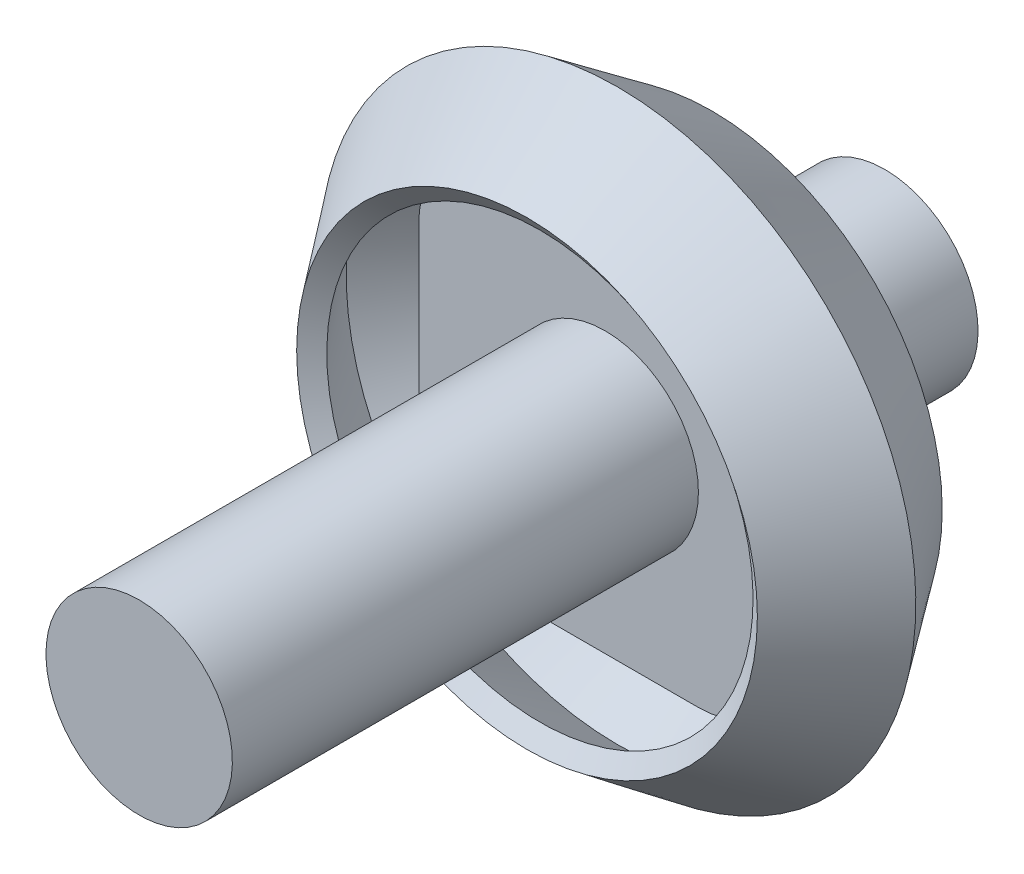
ISO-10303-21;
HEADER;
FILE_DESCRIPTION(('STEP AP214'),'2;1');
FILE_NAME('part.step','',(''),(''),'','','');
FILE_SCHEMA(('AUTOMOTIVE_DESIGN { 1 0 10303 214 1 1 1 1 }'));
ENDSEC;
DATA;
#1=APPLICATION_CONTEXT('core data for automotive mechanical design processes');
#2=APPLICATION_PROTOCOL_DEFINITION('international standard','automotive_design',2000,#1);
#3=PRODUCT_CONTEXT('',#1,'mechanical');
#4=PRODUCT('Part','Part','',(#3));
#5=PRODUCT_RELATED_PRODUCT_CATEGORY('part','',(#4));
#6=PRODUCT_DEFINITION_FORMATION('','',#4);
#7=PRODUCT_DEFINITION_CONTEXT('part definition',#1,'design');
#8=PRODUCT_DEFINITION('design','',#6,#7);
#9=PRODUCT_DEFINITION_SHAPE('','',#8);
#10=(LENGTH_UNIT() NAMED_UNIT(*) SI_UNIT(.MILLI.,.METRE.));
#11=(NAMED_UNIT(*) PLANE_ANGLE_UNIT() SI_UNIT($,.RADIAN.));
#12=(NAMED_UNIT(*) SI_UNIT($,.STERADIAN.) SOLID_ANGLE_UNIT());
#13=UNCERTAINTY_MEASURE_WITH_UNIT(LENGTH_MEASURE(1.E-05),#10,'distance_accuracy_value','');
#14=(GEOMETRIC_REPRESENTATION_CONTEXT(3) GLOBAL_UNCERTAINTY_ASSIGNED_CONTEXT((#13)) GLOBAL_UNIT_ASSIGNED_CONTEXT((#10,
#11,#12)) REPRESENTATION_CONTEXT('',''));
#15=CARTESIAN_POINT('',(0.,0.,0.));
#16=DIRECTION('',(0.,0.,1.));
#17=DIRECTION('',(1.,0.,0.));
#18=AXIS2_PLACEMENT_3D('',#15,#16,#17);
#19=CARTESIAN_POINT('',(0.,1.5875,0.));
#20=DIRECTION('',(0.,0.,-1.));
#21=DIRECTION('',(0.,-1.,0.));
#22=AXIS2_PLACEMENT_3D('',#19,#20,#21);
#23=PLANE('',#22);
#24=CARTESIAN_POINT('',(0.,0.,0.));
#25=DIRECTION('',(0.,0.,-1.));
#26=DIRECTION('',(0.,1.,0.));
#27=AXIS2_PLACEMENT_3D('',#24,#25,#26);
#28=CIRCLE('',#27,3.175);
#29=CARTESIAN_POINT('',(0.,3.175,0.));
#30=VERTEX_POINT('',#29);
#31=EDGE_CURVE('P0_E19',#30,#30,#28,.T.);
#32=ORIENTED_EDGE('',*,*,#31,.T.);
#33=EDGE_LOOP('',(#32));
#34=FACE_BOUND('',#33,.T.);
#35=ADVANCED_FACE('P0_F16',(#34),#23,.T.);
#36=CARTESIAN_POINT('',(0.,0.,12.7));
#37=DIRECTION('',(0.,0.,-1.));
#38=DIRECTION('',(0.,1.,0.));
#39=AXIS2_PLACEMENT_3D('',#36,#37,#38);
#40=CYLINDRICAL_SURFACE('',#39,3.175);
#41=CARTESIAN_POINT('',(0.,0.,25.4));
#42=DIRECTION('',(0.,0.,-1.));
#43=DIRECTION('',(0.,1.,0.));
#44=AXIS2_PLACEMENT_3D('',#41,#42,#43);
#45=CIRCLE('',#44,3.175);
#46=CARTESIAN_POINT('',(0.,3.175,25.4));
#47=VERTEX_POINT('',#46);
#48=EDGE_CURVE('P0_E11',#47,#47,#45,.T.);
#49=ORIENTED_EDGE('',*,*,#48,.T.);
#50=EDGE_LOOP('',(#49));
#51=FACE_BOUND('',#50,.T.);
#52=CARTESIAN_POINT('',(0.,0.,9.525));
#53=DIRECTION('',(0.,0.,1.));
#54=DIRECTION('',(0.,1.,0.));
#55=AXIS2_PLACEMENT_3D('',#52,#53,#54);
#56=CIRCLE('',#55,3.175);
#57=CARTESIAN_POINT('',(0.,-3.175,9.525));
#58=VERTEX_POINT('',#57);
#59=EDGE_CURVE('P0_E168',#58,#58,#56,.T.);
#60=ORIENTED_EDGE('',*,*,#59,.T.);
#61=EDGE_LOOP('',(#60));
#62=FACE_BOUND('',#61,.T.);
#63=ADVANCED_FACE('P0_F296',(#51,#62),#40,.T.);
#64=CARTESIAN_POINT('',(0.,1.5875,25.4));
#65=DIRECTION('',(0.,0.,1.));
#66=DIRECTION('',(1.,0.,0.));
#67=AXIS2_PLACEMENT_3D('',#64,#65,#66);
#68=PLANE('',#67);
#69=ORIENTED_EDGE('',*,*,#48,.F.);
#70=EDGE_LOOP('',(#69));
#71=FACE_BOUND('',#70,.T.);
#72=ADVANCED_FACE('P0_F301',(#71),#68,.T.);
#73=CARTESIAN_POINT('',(0.,0.,12.7));
#74=DIRECTION('',(0.,0.,-1.));
#75=DIRECTION('',(0.,1.,0.));
#76=AXIS2_PLACEMENT_3D('',#73,#74,#75);
#77=CYLINDRICAL_SURFACE('',#76,3.175);
#78=CARTESIAN_POINT('',(0.,0.,6.35));
#79=DIRECTION('',(0.,0.,-1.));
#80=DIRECTION('',(0.,1.,0.));
#81=AXIS2_PLACEMENT_3D('',#78,#79,#80);
#82=CIRCLE('',#81,3.175);
#83=CARTESIAN_POINT('',(0.,-3.175,6.35));
#84=VERTEX_POINT('',#83);
#85=EDGE_CURVE('P0_E156',#84,#84,#82,.T.);
#86=ORIENTED_EDGE('',*,*,#85,.T.);
#87=EDGE_LOOP('',(#86));
#88=FACE_BOUND('',#87,.T.);
#89=ORIENTED_EDGE('',*,*,#31,.F.);
#90=EDGE_LOOP('',(#89));
#91=FACE_BOUND('',#90,.T.);
#92=ADVANCED_FACE('P0_F466',(#88,#91),#77,.T.);
#93=CARTESIAN_POINT('',(3.175,6.35,6.35));
#94=DIRECTION('',(0.,1.,0.));
#95=DIRECTION('',(1.,0.,0.));
#96=AXIS2_PLACEMENT_3D('',#93,#94,#95);
#97=PLANE('',#96);
#98=DIRECTION('',(-1.,0.,0.));
#99=VECTOR('',#98,1.);
#100=CARTESIAN_POINT('',(3.175,6.35,6.35));
#101=LINE('',#100,#99);
#102=CARTESIAN_POINT('',(3.175,6.35,6.35));
#103=VERTEX_POINT('',#102);
#104=CARTESIAN_POINT('',(-3.175,6.35,6.35));
#105=VERTEX_POINT('',#104);
#106=EDGE_CURVE('P0_E164',#103,#105,#101,.T.);
#107=ORIENTED_EDGE('',*,*,#106,.T.);
#108=DIRECTION('',(0.,0.,1.));
#109=VECTOR('',#108,1.);
#110=CARTESIAN_POINT('',(-3.175,6.35,6.35));
#111=LINE('',#110,#109);
#112=CARTESIAN_POINT('',(-3.175,6.35,9.525));
#113=VERTEX_POINT('',#112);
#114=EDGE_CURVE('P0_E180',#105,#113,#111,.T.);
#115=ORIENTED_EDGE('',*,*,#114,.T.);
#116=DIRECTION('',(-1.,0.,0.));
#117=VECTOR('',#116,1.);
#118=CARTESIAN_POINT('',(3.175,6.35,9.525));
#119=LINE('',#118,#117);
#120=CARTESIAN_POINT('',(3.175,6.35,9.525));
#121=VERTEX_POINT('',#120);
#122=EDGE_CURVE('P0_E226',#121,#113,#119,.T.);
#123=ORIENTED_EDGE('',*,*,#122,.F.);
#124=DIRECTION('',(0.,0.,1.));
#125=VECTOR('',#124,1.);
#126=CARTESIAN_POINT('',(3.175,6.35,6.35));
#127=LINE('',#126,#125);
#128=EDGE_CURVE('P0_E159',#103,#121,#127,.T.);
#129=ORIENTED_EDGE('',*,*,#128,.F.);
#130=EDGE_LOOP('',(#107,#115,#123,#129));
#131=FACE_BOUND('',#130,.T.);
#132=ADVANCED_FACE('P0_F280',(#131),#97,.T.);
#133=CARTESIAN_POINT('',(-3.175,3.175,6.35));
#134=DIRECTION('',(0.,0.,1.));
#135=DIRECTION('',(0.,1.,0.));
#136=AXIS2_PLACEMENT_3D('',#133,#134,#135);
#137=CYLINDRICAL_SURFACE('',#136,3.175);
#138=CARTESIAN_POINT('',(-3.175,3.175,6.35));
#139=DIRECTION('',(0.,0.,1.));
#140=DIRECTION('',(0.,1.,0.));
#141=AXIS2_PLACEMENT_3D('',#138,#139,#140);
#142=CIRCLE('',#141,3.175);
#143=CARTESIAN_POINT('',(-6.35,3.175,6.35));
#144=VERTEX_POINT('',#143);
#145=EDGE_CURVE('P0_E160',#105,#144,#142,.T.);
#146=ORIENTED_EDGE('',*,*,#145,.T.);
#147=DIRECTION('',(0.,0.,1.));
#148=VECTOR('',#147,1.);
#149=CARTESIAN_POINT('',(-6.35,3.175,6.35));
#150=LINE('',#149,#148);
#151=CARTESIAN_POINT('',(-6.35,3.175,9.525));
#152=VERTEX_POINT('',#151);
#153=EDGE_CURVE('P0_E150',#144,#152,#150,.T.);
#154=ORIENTED_EDGE('',*,*,#153,.T.);
#155=CARTESIAN_POINT('',(-3.175,3.175,9.525));
#156=DIRECTION('',(0.,0.,1.));
#157=DIRECTION('',(0.,1.,0.));
#158=AXIS2_PLACEMENT_3D('',#155,#156,#157);
#159=CIRCLE('',#158,3.175);
#160=EDGE_CURVE('P0_E217',#113,#152,#159,.T.);
#161=ORIENTED_EDGE('',*,*,#160,.F.);
#162=ORIENTED_EDGE('',*,*,#114,.F.);
#163=EDGE_LOOP('',(#146,#154,#161,#162));
#164=FACE_BOUND('',#163,.T.);
#165=ADVANCED_FACE('P0_F206',(#164),#137,.T.);
#166=CARTESIAN_POINT('',(-6.35,3.175,6.35));
#167=DIRECTION('',(-1.,0.,0.));
#168=DIRECTION('',(0.,0.,1.));
#169=AXIS2_PLACEMENT_3D('',#166,#167,#168);
#170=PLANE('',#169);
#171=DIRECTION('',(0.,-1.,0.));
#172=VECTOR('',#171,1.);
#173=CARTESIAN_POINT('',(-6.35,3.175,6.35));
#174=LINE('',#173,#172);
#175=CARTESIAN_POINT('',(-6.35,-3.175,6.35));
#176=VERTEX_POINT('',#175);
#177=EDGE_CURVE('P0_E186',#144,#176,#174,.T.);
#178=ORIENTED_EDGE('',*,*,#177,.T.);
#179=DIRECTION('',(0.,0.,1.));
#180=VECTOR('',#179,1.);
#181=CARTESIAN_POINT('',(-6.35,-3.175,6.35));
#182=LINE('',#181,#180);
#183=CARTESIAN_POINT('',(-6.35,-3.175,9.525));
#184=VERTEX_POINT('',#183);
#185=EDGE_CURVE('P0_E171',#176,#184,#182,.T.);
#186=ORIENTED_EDGE('',*,*,#185,.T.);
#187=DIRECTION('',(0.,-1.,0.));
#188=VECTOR('',#187,1.);
#189=CARTESIAN_POINT('',(-6.35,3.175,9.525));
#190=LINE('',#189,#188);
#191=EDGE_CURVE('P0_E179',#152,#184,#190,.T.);
#192=ORIENTED_EDGE('',*,*,#191,.F.);
#193=ORIENTED_EDGE('',*,*,#153,.F.);
#194=EDGE_LOOP('',(#178,#186,#192,#193));
#195=FACE_BOUND('',#194,.T.);
#196=ADVANCED_FACE('P0_F199',(#195),#170,.T.);
#197=CARTESIAN_POINT('',(-3.175,-3.175,6.35));
#198=DIRECTION('',(0.,0.,1.));
#199=DIRECTION('',(-1.,0.,0.));
#200=AXIS2_PLACEMENT_3D('',#197,#198,#199);
#201=CYLINDRICAL_SURFACE('',#200,3.175);
#202=CARTESIAN_POINT('',(-3.175,-3.175,6.35));
#203=DIRECTION('',(0.,0.,1.));
#204=DIRECTION('',(-1.,0.,0.));
#205=AXIS2_PLACEMENT_3D('',#202,#203,#204);
#206=CIRCLE('',#205,3.175);
#207=CARTESIAN_POINT('',(-3.175,-6.35,6.35));
#208=VERTEX_POINT('',#207);
#209=EDGE_CURVE('P0_E133',#176,#208,#206,.T.);
#210=ORIENTED_EDGE('',*,*,#209,.T.);
#211=DIRECTION('',(0.,0.,1.));
#212=VECTOR('',#211,1.);
#213=CARTESIAN_POINT('',(-3.175,-6.35,6.35));
#214=LINE('',#213,#212);
#215=CARTESIAN_POINT('',(-3.175,-6.35,9.525));
#216=VERTEX_POINT('',#215);
#217=EDGE_CURVE('P0_E123',#208,#216,#214,.T.);
#218=ORIENTED_EDGE('',*,*,#217,.T.);
#219=CARTESIAN_POINT('',(-3.175,-3.175,9.525));
#220=DIRECTION('',(0.,0.,1.));
#221=DIRECTION('',(-1.,0.,0.));
#222=AXIS2_PLACEMENT_3D('',#219,#220,#221);
#223=CIRCLE('',#222,3.175);
#224=EDGE_CURVE('P0_E174',#184,#216,#223,.T.);
#225=ORIENTED_EDGE('',*,*,#224,.F.);
#226=ORIENTED_EDGE('',*,*,#185,.F.);
#227=EDGE_LOOP('',(#210,#218,#225,#226));
#228=FACE_BOUND('',#227,.T.);
#229=ADVANCED_FACE('P0_F193',(#228),#201,.T.);
#230=CARTESIAN_POINT('',(-3.175,-6.35,6.35));
#231=DIRECTION('',(0.,-1.,0.));
#232=DIRECTION('',(0.,0.,-1.));
#233=AXIS2_PLACEMENT_3D('',#230,#231,#232);
#234=PLANE('',#233);
#235=DIRECTION('',(1.,0.,0.));
#236=VECTOR('',#235,1.);
#237=CARTESIAN_POINT('',(-3.175,-6.35,6.35));
#238=LINE('',#237,#236);
#239=CARTESIAN_POINT('',(3.175,-6.35,6.35));
#240=VERTEX_POINT('',#239);
#241=EDGE_CURVE('P0_E127',#208,#240,#238,.T.);
#242=ORIENTED_EDGE('',*,*,#241,.T.);
#243=DIRECTION('',(0.,0.,1.));
#244=VECTOR('',#243,1.);
#245=CARTESIAN_POINT('',(3.175,-6.35,6.35));
#246=LINE('',#245,#244);
#247=CARTESIAN_POINT('',(3.175,-6.35,9.525));
#248=VERTEX_POINT('',#247);
#249=EDGE_CURVE('P0_E111',#240,#248,#246,.T.);
#250=ORIENTED_EDGE('',*,*,#249,.T.);
#251=DIRECTION('',(1.,0.,0.));
#252=VECTOR('',#251,1.);
#253=CARTESIAN_POINT('',(-3.175,-6.35,9.525));
#254=LINE('',#253,#252);
#255=EDGE_CURVE('P0_E178',#216,#248,#254,.T.);
#256=ORIENTED_EDGE('',*,*,#255,.F.);
#257=ORIENTED_EDGE('',*,*,#217,.F.);
#258=EDGE_LOOP('',(#242,#250,#256,#257));
#259=FACE_BOUND('',#258,.T.);
#260=ADVANCED_FACE('P0_F128',(#259),#234,.T.);
#261=CARTESIAN_POINT('',(3.175,-3.175,6.35));
#262=DIRECTION('',(0.,0.,1.));
#263=DIRECTION('',(0.,-1.,0.));
#264=AXIS2_PLACEMENT_3D('',#261,#262,#263);
#265=CYLINDRICAL_SURFACE('',#264,3.175);
#266=CARTESIAN_POINT('',(3.175,-3.175,6.35));
#267=DIRECTION('',(0.,0.,1.));
#268=DIRECTION('',(0.,-1.,0.));
#269=AXIS2_PLACEMENT_3D('',#266,#267,#268);
#270=CIRCLE('',#269,3.175);
#271=CARTESIAN_POINT('',(6.35,-3.175,6.35));
#272=VERTEX_POINT('',#271);
#273=EDGE_CURVE('P0_E115',#240,#272,#270,.T.);
#274=ORIENTED_EDGE('',*,*,#273,.T.);
#275=DIRECTION('',(0.,0.,1.));
#276=VECTOR('',#275,1.);
#277=CARTESIAN_POINT('',(6.35,-3.175,6.35));
#278=LINE('',#277,#276);
#279=CARTESIAN_POINT('',(6.35,-3.175,9.525));
#280=VERTEX_POINT('',#279);
#281=EDGE_CURVE('P0_E124',#272,#280,#278,.T.);
#282=ORIENTED_EDGE('',*,*,#281,.T.);
#283=CARTESIAN_POINT('',(3.175,-3.175,9.525));
#284=DIRECTION('',(0.,0.,1.));
#285=DIRECTION('',(0.,-1.,0.));
#286=AXIS2_PLACEMENT_3D('',#283,#284,#285);
#287=CIRCLE('',#286,3.175);
#288=EDGE_CURVE('P0_E118',#248,#280,#287,.T.);
#289=ORIENTED_EDGE('',*,*,#288,.F.);
#290=ORIENTED_EDGE('',*,*,#249,.F.);
#291=EDGE_LOOP('',(#274,#282,#289,#290));
#292=FACE_BOUND('',#291,.T.);
#293=ADVANCED_FACE('P0_F113',(#292),#265,.T.);
#294=CARTESIAN_POINT('',(6.35,-3.175,6.35));
#295=DIRECTION('',(1.,0.,0.));
#296=DIRECTION('',(0.,1.,0.));
#297=AXIS2_PLACEMENT_3D('',#294,#295,#296);
#298=PLANE('',#297);
#299=DIRECTION('',(0.,1.,0.));
#300=VECTOR('',#299,1.);
#301=CARTESIAN_POINT('',(6.35,-3.175,6.35));
#302=LINE('',#301,#300);
#303=CARTESIAN_POINT('',(6.35,3.175,6.35));
#304=VERTEX_POINT('',#303);
#305=EDGE_CURVE('P0_E139',#272,#304,#302,.T.);
#306=ORIENTED_EDGE('',*,*,#305,.T.);
#307=DIRECTION('',(0.,0.,1.));
#308=VECTOR('',#307,1.);
#309=CARTESIAN_POINT('',(6.35,3.175,6.35));
#310=LINE('',#309,#308);
#311=CARTESIAN_POINT('',(6.35,3.175,9.525));
#312=VERTEX_POINT('',#311);
#313=EDGE_CURVE('P0_E161',#304,#312,#310,.T.);
#314=ORIENTED_EDGE('',*,*,#313,.T.);
#315=DIRECTION('',(0.,1.,0.));
#316=VECTOR('',#315,1.);
#317=CARTESIAN_POINT('',(6.35,-3.175,9.525));
#318=LINE('',#317,#316);
#319=EDGE_CURVE('P0_E151',#280,#312,#318,.T.);
#320=ORIENTED_EDGE('',*,*,#319,.F.);
#321=ORIENTED_EDGE('',*,*,#281,.F.);
#322=EDGE_LOOP('',(#306,#314,#320,#321));
#323=FACE_BOUND('',#322,.T.);
#324=ADVANCED_FACE('P0_F237',(#323),#298,.T.);
#325=CARTESIAN_POINT('',(3.175,3.175,6.35));
#326=DIRECTION('',(0.,0.,1.));
#327=DIRECTION('',(1.,0.,0.));
#328=AXIS2_PLACEMENT_3D('',#325,#326,#327);
#329=CYLINDRICAL_SURFACE('',#328,3.175);
#330=CARTESIAN_POINT('',(3.175,3.175,6.35));
#331=DIRECTION('',(0.,0.,1.));
#332=DIRECTION('',(1.,0.,0.));
#333=AXIS2_PLACEMENT_3D('',#330,#331,#332);
#334=CIRCLE('',#333,3.175);
#335=EDGE_CURVE('P0_E146',#304,#103,#334,.T.);
#336=ORIENTED_EDGE('',*,*,#335,.T.);
#337=ORIENTED_EDGE('',*,*,#128,.T.);
#338=CARTESIAN_POINT('',(3.175,3.175,9.525));
#339=DIRECTION('',(0.,0.,1.));
#340=DIRECTION('',(1.,0.,0.));
#341=AXIS2_PLACEMENT_3D('',#338,#339,#340);
#342=CIRCLE('',#341,3.175);
#343=EDGE_CURVE('P0_E155',#312,#121,#342,.T.);
#344=ORIENTED_EDGE('',*,*,#343,.F.);
#345=ORIENTED_EDGE('',*,*,#313,.F.);
#346=EDGE_LOOP('',(#336,#337,#344,#345));
#347=FACE_BOUND('',#346,.T.);
#348=ADVANCED_FACE('P0_F282',(#347),#329,.T.);
#349=CARTESIAN_POINT('',(0.,0.,6.35));
#350=DIRECTION('',(0.,0.,1.));
#351=DIRECTION('',(1.,0.,0.));
#352=AXIS2_PLACEMENT_3D('',#349,#350,#351);
#353=PLANE('',#352);
#354=ORIENTED_EDGE('',*,*,#85,.F.);
#355=EDGE_LOOP('',(#354));
#356=FACE_BOUND('',#355,.T.);
#357=ORIENTED_EDGE('',*,*,#106,.F.);
#358=ORIENTED_EDGE('',*,*,#335,.F.);
#359=ORIENTED_EDGE('',*,*,#305,.F.);
#360=ORIENTED_EDGE('',*,*,#273,.F.);
#361=ORIENTED_EDGE('',*,*,#241,.F.);
#362=ORIENTED_EDGE('',*,*,#209,.F.);
#363=ORIENTED_EDGE('',*,*,#177,.F.);
#364=ORIENTED_EDGE('',*,*,#145,.F.);
#365=EDGE_LOOP('',(#357,#358,#359,#360,#361,#362,#363,#364));
#366=FACE_BOUND('',#365,.T.);
#367=ADVANCED_FACE('P0_F136',(#356,#366),#353,.F.);
#368=CARTESIAN_POINT('',(0.,0.,9.525));
#369=DIRECTION('',(0.,0.,1.));
#370=DIRECTION('',(1.,0.,0.));
#371=AXIS2_PLACEMENT_3D('',#368,#369,#370);
#372=PLANE('',#371);
#373=ORIENTED_EDGE('',*,*,#59,.F.);
#374=EDGE_LOOP('',(#373));
#375=FACE_BOUND('',#374,.T.);
#376=ORIENTED_EDGE('',*,*,#122,.T.);
#377=ORIENTED_EDGE('',*,*,#160,.T.);
#378=ORIENTED_EDGE('',*,*,#191,.T.);
#379=ORIENTED_EDGE('',*,*,#224,.T.);
#380=ORIENTED_EDGE('',*,*,#255,.T.);
#381=ORIENTED_EDGE('',*,*,#288,.T.);
#382=ORIENTED_EDGE('',*,*,#319,.T.);
#383=ORIENTED_EDGE('',*,*,#343,.T.);
#384=EDGE_LOOP('',(#376,#377,#378,#379,#380,#381,#382,#383));
#385=FACE_BOUND('',#384,.T.);
#386=ADVANCED_FACE('P0_F240',(#375,#385),#372,.T.);
#387=CLOSED_SHELL('',(#35,#63,#72,#92,#132,#165,#196,#229,#260,#293,#324,#348,#367,#386));
#388=MANIFOLD_SOLID_BREP('P0_B1',#387);
#389=CARTESIAN_POINT('',(0.,0.,6.12088320407754));
#390=DIRECTION('',(0.,0.,-1.));
#391=DIRECTION('',(0.,1.,0.));
#392=AXIS2_PLACEMENT_3D('',#389,#390,#391);
#393=CYLINDRICAL_SURFACE('',#392,3.175);
#394=CARTESIAN_POINT('',(0.,0.,5.89176640815507));
#395=DIRECTION('',(0.,0.,-1.));
#396=DIRECTION('',(0.,1.,0.));
#397=AXIS2_PLACEMENT_3D('',#394,#395,#396);
#398=CIRCLE('',#397,3.175);
#399=CARTESIAN_POINT('',(0.,3.175,5.89176640815507));
#400=VERTEX_POINT('',#399);
#401=EDGE_CURVE('P1_E11',#400,#400,#398,.T.);
#402=ORIENTED_EDGE('',*,*,#401,.T.);
#403=EDGE_LOOP('',(#402));
#404=FACE_BOUND('',#403,.T.);
#405=CARTESIAN_POINT('',(0.,0.,6.35));
#406=DIRECTION('',(0.,0.,-1.));
#407=DIRECTION('',(0.,1.,0.));
#408=AXIS2_PLACEMENT_3D('',#405,#406,#407);
#409=CIRCLE('',#408,3.175);
#410=CARTESIAN_POINT('',(0.,3.175,6.35));
#411=VERTEX_POINT('',#410);
#412=EDGE_CURVE('P1_E81',#411,#411,#409,.T.);
#413=ORIENTED_EDGE('',*,*,#412,.F.);
#414=EDGE_LOOP('',(#413));
#415=FACE_BOUND('',#414,.T.);
#416=ADVANCED_FACE('P1_F16',(#404,#415),#393,.F.);
#417=CARTESIAN_POINT('',(0.,5.51096957656619,5.89176640815507));
#418=DIRECTION('',(0.,0.,-1.));
#419=DIRECTION('',(0.,-1.,0.));
#420=AXIS2_PLACEMENT_3D('',#417,#418,#419);
#421=PLANE('',#420);
#422=ORIENTED_EDGE('',*,*,#401,.F.);
#423=EDGE_LOOP('',(#422));
#424=FACE_BOUND('',#423,.T.);
#425=CARTESIAN_POINT('',(0.,0.,5.89176640815507));
#426=DIRECTION('',(0.,0.,-1.));
#427=DIRECTION('',(0.,1.,0.));
#428=AXIS2_PLACEMENT_3D('',#425,#426,#427);
#429=CIRCLE('',#428,7.8469391531324);
#430=CARTESIAN_POINT('',(0.,7.8469391531324,5.89176640815507));
#431=VERTEX_POINT('',#430);
#432=EDGE_CURVE('P1_E26',#431,#431,#429,.T.);
#433=ORIENTED_EDGE('',*,*,#432,.T.);
#434=EDGE_LOOP('',(#433));
#435=FACE_BOUND('',#434,.T.);
#436=ADVANCED_FACE('P1_F109',(#424,#435),#421,.T.);
#437=CARTESIAN_POINT('',(0.,0.,7.49808802619695));
#438=DIRECTION('',(0.,0.,1.));
#439=DIRECTION('',(0.,1.,0.));
#440=AXIS2_PLACEMENT_3D('',#437,#438,#439);
#441=CONICAL_SURFACE('',#440,9.00346957656619,0.62401438422253);
#442=CARTESIAN_POINT('',(0.,0.,9.10440964423883));
#443=DIRECTION('',(0.,0.,-1.));
#444=DIRECTION('',(0.,1.,0.));
#445=AXIS2_PLACEMENT_3D('',#442,#443,#444);
#446=CIRCLE('',#445,10.16);
#447=CARTESIAN_POINT('',(0.,10.16,9.10440964423883));
#448=VERTEX_POINT('',#447);
#449=EDGE_CURVE('P1_E65',#448,#448,#446,.T.);
#450=ORIENTED_EDGE('',*,*,#449,.T.);
#451=EDGE_LOOP('',(#450));
#452=FACE_BOUND('',#451,.T.);
#453=ORIENTED_EDGE('',*,*,#432,.F.);
#454=EDGE_LOOP('',(#453));
#455=FACE_BOUND('',#454,.T.);
#456=ADVANCED_FACE('P1_F113',(#452,#455),#441,.T.);
#457=CARTESIAN_POINT('',(0.,0.,10.6464502419583));
#458=DIRECTION('',(0.,0.,-1.));
#459=DIRECTION('',(0.,1.,0.));
#460=AXIS2_PLACEMENT_3D('',#457,#458,#459);
#461=CONICAL_SURFACE('',#460,9.00346957656619,0.643501097741968);
#462=CARTESIAN_POINT('',(0.,0.,12.1884908396777));
#463=DIRECTION('',(0.,0.,-1.));
#464=DIRECTION('',(0.,1.,0.));
#465=AXIS2_PLACEMENT_3D('',#462,#463,#464);
#466=CIRCLE('',#465,7.8469391531324);
#467=CARTESIAN_POINT('',(0.,7.8469391531324,12.1884908396777));
#468=VERTEX_POINT('',#467);
#469=EDGE_CURVE('P1_E19',#468,#468,#466,.T.);
#470=ORIENTED_EDGE('',*,*,#469,.T.);
#471=EDGE_LOOP('',(#470));
#472=FACE_BOUND('',#471,.T.);
#473=ORIENTED_EDGE('',*,*,#449,.F.);
#474=EDGE_LOOP('',(#473));
#475=FACE_BOUND('',#474,.T.);
#476=ADVANCED_FACE('P1_F61',(#472,#475),#461,.T.);
#477=CARTESIAN_POINT('',(0.,0.,11.9685427315507));
#478=DIRECTION('',(0.,0.,1.));
#479=DIRECTION('',(0.,1.,0.));
#480=AXIS2_PLACEMENT_3D('',#477,#478,#479);
#481=CONICAL_SURFACE('',#480,7.55367500266029,0.927295227258032);
#482=CARTESIAN_POINT('',(0.,0.,11.7485946234237));
#483=DIRECTION('',(0.,0.,-1.));
#484=DIRECTION('',(0.,1.,0.));
#485=AXIS2_PLACEMENT_3D('',#482,#483,#484);
#486=CIRCLE('',#485,7.26041085218819);
#487=CARTESIAN_POINT('',(0.,7.26041085218819,11.7485946234237));
#488=VERTEX_POINT('',#487);
#489=EDGE_CURVE('P1_E66',#488,#488,#486,.T.);
#490=ORIENTED_EDGE('',*,*,#489,.T.);
#491=EDGE_LOOP('',(#490));
#492=FACE_BOUND('',#491,.T.);
#493=ORIENTED_EDGE('',*,*,#469,.F.);
#494=EDGE_LOOP('',(#493));
#495=FACE_BOUND('',#494,.T.);
#496=ADVANCED_FACE('P1_F124',(#492,#495),#481,.F.);
#497=CARTESIAN_POINT('',(0.,0.,10.4265021338313));
#498=DIRECTION('',(0.,0.,-1.));
#499=DIRECTION('',(0.,1.,0.));
#500=AXIS2_PLACEMENT_3D('',#497,#498,#499);
#501=CONICAL_SURFACE('',#500,8.25198019807203,0.643501097741968);
#502=CARTESIAN_POINT('',(0.,0.,9.10440964423883));
#503=DIRECTION('',(0.,0.,-1.));
#504=DIRECTION('',(0.,1.,0.));
#505=AXIS2_PLACEMENT_3D('',#502,#503,#504);
#506=CIRCLE('',#505,9.24354954395584);
#507=CARTESIAN_POINT('',(0.,9.24354954395584,9.10440964423883));
#508=VERTEX_POINT('',#507);
#509=EDGE_CURVE('P1_E73',#508,#508,#506,.T.);
#510=ORIENTED_EDGE('',*,*,#509,.T.);
#511=EDGE_LOOP('',(#510));
#512=FACE_BOUND('',#511,.T.);
#513=ORIENTED_EDGE('',*,*,#489,.F.);
#514=EDGE_LOOP('',(#513));
#515=FACE_BOUND('',#514,.T.);
#516=ADVANCED_FACE('P1_F105',(#512,#515),#501,.F.);
#517=CARTESIAN_POINT('',(0.,0.,7.72720482211942));
#518=DIRECTION('',(0.,0.,1.));
#519=DIRECTION('',(0.,1.,0.));
#520=AXIS2_PLACEMENT_3D('',#517,#518,#519);
#521=CONICAL_SURFACE('',#520,8.25198019807203,0.624014384222531);
#522=CARTESIAN_POINT('',(0.,0.,6.35));
#523=DIRECTION('',(0.,0.,-1.));
#524=DIRECTION('',(0.,1.,0.));
#525=AXIS2_PLACEMENT_3D('',#522,#523,#524);
#526=CIRCLE('',#525,7.26041085218819);
#527=CARTESIAN_POINT('',(0.,7.26041085218819,6.35));
#528=VERTEX_POINT('',#527);
#529=EDGE_CURVE('P1_E86',#528,#528,#526,.T.);
#530=ORIENTED_EDGE('',*,*,#529,.T.);
#531=EDGE_LOOP('',(#530));
#532=FACE_BOUND('',#531,.T.);
#533=ORIENTED_EDGE('',*,*,#509,.F.);
#534=EDGE_LOOP('',(#533));
#535=FACE_BOUND('',#534,.T.);
#536=ADVANCED_FACE('P1_F94',(#532,#535),#521,.F.);
#537=CARTESIAN_POINT('',(0.,5.21770542609409,6.35));
#538=DIRECTION('',(0.,0.,1.));
#539=DIRECTION('',(1.,0.,0.));
#540=AXIS2_PLACEMENT_3D('',#537,#538,#539);
#541=PLANE('',#540);
#542=ORIENTED_EDGE('',*,*,#412,.T.);
#543=EDGE_LOOP('',(#542));
#544=FACE_BOUND('',#543,.T.);
#545=ORIENTED_EDGE('',*,*,#529,.F.);
#546=EDGE_LOOP('',(#545));
#547=FACE_BOUND('',#546,.T.);
#548=ADVANCED_FACE('P1_F97',(#544,#547),#541,.T.);
#549=CLOSED_SHELL('',(#416,#436,#456,#476,#496,#516,#536,#548));
#550=MANIFOLD_SOLID_BREP('P1_B1',#549);
#551=ADVANCED_BREP_SHAPE_REPRESENTATION('',(#18,#388,#550),#14);
#552=SHAPE_DEFINITION_REPRESENTATION(#9,#551);
ENDSEC;
END-ISO-10303-21;
